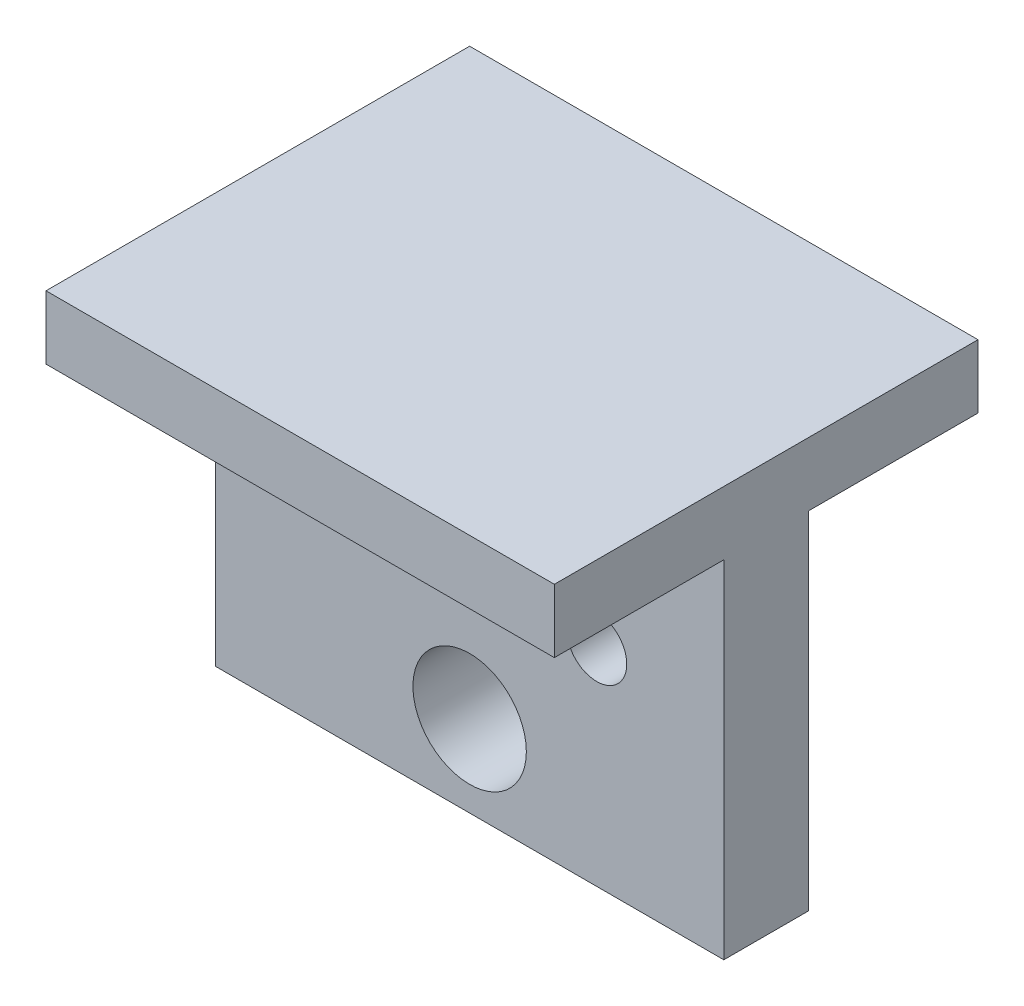
ISO-10303-21;
HEADER;
FILE_DESCRIPTION(('STEP AP214'),'2;1');
FILE_NAME('part.step','',(''),(''),'','','');
FILE_SCHEMA(('AUTOMOTIVE_DESIGN { 1 0 10303 214 1 1 1 1 }'));
ENDSEC;
DATA;
#1=APPLICATION_CONTEXT('core data for automotive mechanical design processes');
#2=APPLICATION_PROTOCOL_DEFINITION('international standard','automotive_design',2000,#1);
#3=PRODUCT_CONTEXT('',#1,'mechanical');
#4=PRODUCT('Part','Part','',(#3));
#5=PRODUCT_RELATED_PRODUCT_CATEGORY('part','',(#4));
#6=PRODUCT_DEFINITION_FORMATION('','',#4);
#7=PRODUCT_DEFINITION_CONTEXT('part definition',#1,'design');
#8=PRODUCT_DEFINITION('design','',#6,#7);
#9=PRODUCT_DEFINITION_SHAPE('','',#8);
#10=(LENGTH_UNIT() NAMED_UNIT(*) SI_UNIT(.MILLI.,.METRE.));
#11=(NAMED_UNIT(*) PLANE_ANGLE_UNIT() SI_UNIT($,.RADIAN.));
#12=(NAMED_UNIT(*) SI_UNIT($,.STERADIAN.) SOLID_ANGLE_UNIT());
#13=UNCERTAINTY_MEASURE_WITH_UNIT(LENGTH_MEASURE(1.E-05),#10,'distance_accuracy_value','');
#14=(GEOMETRIC_REPRESENTATION_CONTEXT(3) GLOBAL_UNCERTAINTY_ASSIGNED_CONTEXT((#13)) GLOBAL_UNIT_ASSIGNED_CONTEXT((#10,
#11,#12)) REPRESENTATION_CONTEXT('',''));
#15=CARTESIAN_POINT('',(0.,0.,0.));
#16=DIRECTION('',(0.,0.,1.));
#17=DIRECTION('',(1.,0.,0.));
#18=AXIS2_PLACEMENT_3D('',#15,#16,#17);
#19=CARTESIAN_POINT('',(0.,39.7023307712424,31.75));
#20=DIRECTION('',(0.,1.,0.));
#21=DIRECTION('',(0.,0.,1.));
#22=AXIS2_PLACEMENT_3D('',#19,#20,#21);
#23=PLANE('',#22);
#24=DIRECTION('',(1.,0.,0.));
#25=VECTOR('',#24,1.);
#26=CARTESIAN_POINT('',(0.,39.7023307712424,-6.35));
#27=LINE('',#26,#25);
#28=CARTESIAN_POINT('',(-38.1,39.7023307712424,-6.35));
#29=VERTEX_POINT('',#28);
#30=CARTESIAN_POINT('',(38.1,39.7023307712424,-6.35));
#31=VERTEX_POINT('',#30);
#32=EDGE_CURVE('E275',#29,#31,#27,.T.);
#33=ORIENTED_EDGE('',*,*,#32,.F.);
#34=DIRECTION('',(0.,0.,-1.));
#35=VECTOR('',#34,1.);
#36=CARTESIAN_POINT('',(-38.1,39.7023307712424,31.75));
#37=LINE('',#36,#35);
#38=CARTESIAN_POINT('',(-38.1,39.7023307712424,-31.75));
#39=VERTEX_POINT('',#38);
#40=EDGE_CURVE('E88',#29,#39,#37,.T.);
#41=ORIENTED_EDGE('',*,*,#40,.T.);
#42=DIRECTION('',(1.,0.,0.));
#43=VECTOR('',#42,1.);
#44=CARTESIAN_POINT('',(0.,39.7023307712424,-31.75));
#45=LINE('',#44,#43);
#46=CARTESIAN_POINT('',(38.1,39.7023307712424,-31.75));
#47=VERTEX_POINT('',#46);
#48=EDGE_CURVE('E156',#39,#47,#45,.T.);
#49=ORIENTED_EDGE('',*,*,#48,.T.);
#50=DIRECTION('',(0.,0.,-1.));
#51=VECTOR('',#50,1.);
#52=CARTESIAN_POINT('',(38.1,39.7023307712424,31.75));
#53=LINE('',#52,#51);
#54=EDGE_CURVE('E49',#31,#47,#53,.T.);
#55=ORIENTED_EDGE('',*,*,#54,.F.);
#56=EDGE_LOOP('',(#33,#41,#49,#55));
#57=FACE_BOUND('',#56,.T.);
#58=ADVANCED_FACE('F41',(#57),#23,.F.);
#59=CARTESIAN_POINT('',(-38.1,39.7023307712424,31.75));
#60=VERTEX_POINT('',#59);
#61=CARTESIAN_POINT('',(-38.1,39.7023307712424,6.35));
#62=VERTEX_POINT('',#61);
#63=EDGE_CURVE('E65',#60,#62,#37,.T.);
#64=ORIENTED_EDGE('',*,*,#63,.T.);
#65=DIRECTION('',(1.,0.,0.));
#66=VECTOR('',#65,1.);
#67=CARTESIAN_POINT('',(0.,39.7023307712424,6.35));
#68=LINE('',#67,#66);
#69=CARTESIAN_POINT('',(38.1,39.7023307712424,6.35));
#70=VERTEX_POINT('',#69);
#71=EDGE_CURVE('E124',#62,#70,#68,.T.);
#72=ORIENTED_EDGE('',*,*,#71,.T.);
#73=CARTESIAN_POINT('',(38.1,39.7023307712424,31.75));
#74=VERTEX_POINT('',#73);
#75=EDGE_CURVE('E11',#74,#70,#53,.T.);
#76=ORIENTED_EDGE('',*,*,#75,.F.);
#77=DIRECTION('',(1.,0.,0.));
#78=VECTOR('',#77,1.);
#79=CARTESIAN_POINT('',(0.,39.7023307712424,31.75));
#80=LINE('',#79,#78);
#81=EDGE_CURVE('E131',#60,#74,#80,.T.);
#82=ORIENTED_EDGE('',*,*,#81,.F.);
#83=EDGE_LOOP('',(#64,#72,#76,#82));
#84=FACE_BOUND('',#83,.T.);
#85=ADVANCED_FACE('F43',(#84),#23,.F.);
#86=CARTESIAN_POINT('',(38.1,0.,31.75));
#87=DIRECTION('',(-1.,0.,0.));
#88=DIRECTION('',(0.,0.,1.));
#89=AXIS2_PLACEMENT_3D('',#86,#87,#88);
#90=PLANE('',#89);
#91=DIRECTION('',(0.,1.,0.));
#92=VECTOR('',#91,1.);
#93=CARTESIAN_POINT('',(38.1,0.,-31.75));
#94=LINE('',#93,#92);
#95=CARTESIAN_POINT('',(38.1,49.2258758493717,-31.75));
#96=VERTEX_POINT('',#95);
#97=EDGE_CURVE('E148',#47,#96,#94,.T.);
#98=ORIENTED_EDGE('',*,*,#97,.T.);
#99=DIRECTION('',(0.,0.,-1.));
#100=VECTOR('',#99,1.);
#101=CARTESIAN_POINT('',(38.1,49.2258758493717,31.75));
#102=LINE('',#101,#100);
#103=CARTESIAN_POINT('',(38.1,49.2258758493717,31.75));
#104=VERTEX_POINT('',#103);
#105=EDGE_CURVE('E135',#104,#96,#102,.T.);
#106=ORIENTED_EDGE('',*,*,#105,.F.);
#107=DIRECTION('',(0.,1.,0.));
#108=VECTOR('',#107,1.);
#109=CARTESIAN_POINT('',(38.1,0.,31.75));
#110=LINE('',#109,#108);
#111=EDGE_CURVE('E95',#74,#104,#110,.T.);
#112=ORIENTED_EDGE('',*,*,#111,.F.);
#113=ORIENTED_EDGE('',*,*,#75,.T.);
#114=DIRECTION('',(0.,1.,0.));
#115=VECTOR('',#114,1.);
#116=CARTESIAN_POINT('',(38.1,0.,6.35));
#117=LINE('',#116,#115);
#118=CARTESIAN_POINT('',(38.1,-12.224,6.35));
#119=VERTEX_POINT('',#118);
#120=EDGE_CURVE('E56',#119,#70,#117,.T.);
#121=ORIENTED_EDGE('',*,*,#120,.F.);
#122=DIRECTION('',(0.,0.,-1.));
#123=VECTOR('',#122,1.);
#124=CARTESIAN_POINT('',(38.1,-12.224,6.35));
#125=LINE('',#124,#123);
#126=CARTESIAN_POINT('',(38.1,-12.224,-6.35));
#127=VERTEX_POINT('',#126);
#128=EDGE_CURVE('E160',#119,#127,#125,.T.);
#129=ORIENTED_EDGE('',*,*,#128,.T.);
#130=DIRECTION('',(0.,1.,0.));
#131=VECTOR('',#130,1.);
#132=CARTESIAN_POINT('',(38.1,0.,-6.35));
#133=LINE('',#132,#131);
#134=EDGE_CURVE('E151',#127,#31,#133,.T.);
#135=ORIENTED_EDGE('',*,*,#134,.T.);
#136=ORIENTED_EDGE('',*,*,#54,.T.);
#137=EDGE_LOOP('',(#98,#106,#112,#113,#121,#129,#135,#136));
#138=FACE_BOUND('',#137,.T.);
#139=ADVANCED_FACE('F147',(#138),#90,.F.);
#140=CARTESIAN_POINT('',(0.,49.2258758493717,31.75));
#141=DIRECTION('',(0.,1.,0.));
#142=DIRECTION('',(0.,0.,1.));
#143=AXIS2_PLACEMENT_3D('',#140,#141,#142);
#144=PLANE('',#143);
#145=DIRECTION('',(1.,0.,0.));
#146=VECTOR('',#145,1.);
#147=CARTESIAN_POINT('',(0.,49.2258758493717,-31.75));
#148=LINE('',#147,#146);
#149=CARTESIAN_POINT('',(-38.1,49.2258758493717,-31.75));
#150=VERTEX_POINT('',#149);
#151=EDGE_CURVE('E157',#150,#96,#148,.T.);
#152=ORIENTED_EDGE('',*,*,#151,.F.);
#153=DIRECTION('',(0.,0.,-1.));
#154=VECTOR('',#153,1.);
#155=CARTESIAN_POINT('',(-38.1,49.2258758493717,31.75));
#156=LINE('',#155,#154);
#157=CARTESIAN_POINT('',(-38.1,49.2258758493717,31.75));
#158=VERTEX_POINT('',#157);
#159=EDGE_CURVE('E133',#158,#150,#156,.T.);
#160=ORIENTED_EDGE('',*,*,#159,.F.);
#161=DIRECTION('',(1.,0.,0.));
#162=VECTOR('',#161,1.);
#163=CARTESIAN_POINT('',(0.,49.2258758493717,31.75));
#164=LINE('',#163,#162);
#165=EDGE_CURVE('E166',#158,#104,#164,.T.);
#166=ORIENTED_EDGE('',*,*,#165,.T.);
#167=ORIENTED_EDGE('',*,*,#105,.T.);
#168=EDGE_LOOP('',(#152,#160,#166,#167));
#169=FACE_BOUND('',#168,.T.);
#170=ADVANCED_FACE('F179',(#169),#144,.T.);
#171=CARTESIAN_POINT('',(-38.1,0.,31.75));
#172=DIRECTION('',(-1.,0.,0.));
#173=DIRECTION('',(0.,0.,1.));
#174=AXIS2_PLACEMENT_3D('',#171,#172,#173);
#175=PLANE('',#174);
#176=DIRECTION('',(0.,1.,0.));
#177=VECTOR('',#176,1.);
#178=CARTESIAN_POINT('',(-38.1,0.,-31.75));
#179=LINE('',#178,#177);
#180=EDGE_CURVE('E139',#39,#150,#179,.T.);
#181=ORIENTED_EDGE('',*,*,#180,.F.);
#182=ORIENTED_EDGE('',*,*,#40,.F.);
#183=DIRECTION('',(0.,-1.,0.));
#184=VECTOR('',#183,1.);
#185=CARTESIAN_POINT('',(-38.1,0.,-6.35));
#186=LINE('',#185,#184);
#187=CARTESIAN_POINT('',(-38.1,-12.224,-6.35));
#188=VERTEX_POINT('',#187);
#189=EDGE_CURVE('E276',#29,#188,#186,.T.);
#190=ORIENTED_EDGE('',*,*,#189,.T.);
#191=DIRECTION('',(0.,0.,-1.));
#192=VECTOR('',#191,1.);
#193=CARTESIAN_POINT('',(-38.1,-12.224,6.35));
#194=LINE('',#193,#192);
#195=CARTESIAN_POINT('',(-38.1,-12.224,6.35));
#196=VERTEX_POINT('',#195);
#197=EDGE_CURVE('E122',#196,#188,#194,.T.);
#198=ORIENTED_EDGE('',*,*,#197,.F.);
#199=DIRECTION('',(0.,-1.,0.));
#200=VECTOR('',#199,1.);
#201=CARTESIAN_POINT('',(-38.1,0.,6.35));
#202=LINE('',#201,#200);
#203=EDGE_CURVE('E117',#62,#196,#202,.T.);
#204=ORIENTED_EDGE('',*,*,#203,.F.);
#205=ORIENTED_EDGE('',*,*,#63,.F.);
#206=DIRECTION('',(0.,1.,0.));
#207=VECTOR('',#206,1.);
#208=CARTESIAN_POINT('',(-38.1,0.,31.75));
#209=LINE('',#208,#207);
#210=EDGE_CURVE('E137',#60,#158,#209,.T.);
#211=ORIENTED_EDGE('',*,*,#210,.T.);
#212=ORIENTED_EDGE('',*,*,#159,.T.);
#213=EDGE_LOOP('',(#181,#182,#190,#198,#204,#205,#211,#212));
#214=FACE_BOUND('',#213,.T.);
#215=ADVANCED_FACE('F119',(#214),#175,.T.);
#216=CARTESIAN_POINT('',(0.,0.,31.75));
#217=DIRECTION('',(0.,0.,1.));
#218=DIRECTION('',(1.,0.,0.));
#219=AXIS2_PLACEMENT_3D('',#216,#217,#218);
#220=PLANE('',#219);
#221=ORIENTED_EDGE('',*,*,#81,.T.);
#222=ORIENTED_EDGE('',*,*,#111,.T.);
#223=ORIENTED_EDGE('',*,*,#165,.F.);
#224=ORIENTED_EDGE('',*,*,#210,.F.);
#225=EDGE_LOOP('',(#221,#222,#223,#224));
#226=FACE_BOUND('',#225,.T.);
#227=ADVANCED_FACE('F170',(#226),#220,.T.);
#228=CARTESIAN_POINT('',(0.,0.,-31.75));
#229=DIRECTION('',(0.,0.,1.));
#230=DIRECTION('',(1.,0.,0.));
#231=AXIS2_PLACEMENT_3D('',#228,#229,#230);
#232=PLANE('',#231);
#233=ORIENTED_EDGE('',*,*,#48,.F.);
#234=ORIENTED_EDGE('',*,*,#180,.T.);
#235=ORIENTED_EDGE('',*,*,#151,.T.);
#236=ORIENTED_EDGE('',*,*,#97,.F.);
#237=EDGE_LOOP('',(#233,#234,#235,#236));
#238=FACE_BOUND('',#237,.T.);
#239=ADVANCED_FACE('F154',(#238),#232,.F.);
#240=CARTESIAN_POINT('',(0.,-12.224,6.35));
#241=DIRECTION('',(0.,1.,0.));
#242=DIRECTION('',(0.,0.,1.));
#243=AXIS2_PLACEMENT_3D('',#240,#241,#242);
#244=PLANE('',#243);
#245=DIRECTION('',(1.,0.,0.));
#246=VECTOR('',#245,1.);
#247=CARTESIAN_POINT('',(0.,-12.224,-6.35));
#248=LINE('',#247,#246);
#249=EDGE_CURVE('E278',#188,#127,#248,.T.);
#250=ORIENTED_EDGE('',*,*,#249,.T.);
#251=ORIENTED_EDGE('',*,*,#128,.F.);
#252=DIRECTION('',(1.,0.,0.));
#253=VECTOR('',#252,1.);
#254=CARTESIAN_POINT('',(0.,-12.224,6.35));
#255=LINE('',#254,#253);
#256=EDGE_CURVE('E123',#196,#119,#255,.T.);
#257=ORIENTED_EDGE('',*,*,#256,.F.);
#258=ORIENTED_EDGE('',*,*,#197,.T.);
#259=EDGE_LOOP('',(#250,#251,#257,#258));
#260=FACE_BOUND('',#259,.T.);
#261=ADVANCED_FACE('F177',(#260),#244,.F.);
#262=CARTESIAN_POINT('',(0.,0.,6.35));
#263=DIRECTION('',(0.,0.,-1.));
#264=DIRECTION('',(-1.,0.,0.));
#265=AXIS2_PLACEMENT_3D('',#262,#263,#264);
#266=CYLINDRICAL_SURFACE('',#265,8.5);
#267=CARTESIAN_POINT('',(0.,0.,6.35));
#268=DIRECTION('',(0.,0.,1.));
#269=DIRECTION('',(1.,0.,0.));
#270=AXIS2_PLACEMENT_3D('',#267,#268,#269);
#271=CIRCLE('',#270,8.5);
#272=CARTESIAN_POINT('',(8.5,0.,6.35));
#273=VERTEX_POINT('',#272);
#274=EDGE_CURVE('E129',#273,#273,#271,.T.);
#275=ORIENTED_EDGE('',*,*,#274,.T.);
#276=EDGE_LOOP('',(#275));
#277=FACE_BOUND('',#276,.T.);
#278=CARTESIAN_POINT('',(0.,0.,-6.35));
#279=DIRECTION('',(0.,0.,1.));
#280=DIRECTION('',(1.,0.,0.));
#281=AXIS2_PLACEMENT_3D('',#278,#279,#280);
#282=CIRCLE('',#281,8.5);
#283=CARTESIAN_POINT('',(8.5,0.,-6.35));
#284=VERTEX_POINT('',#283);
#285=EDGE_CURVE('E274',#284,#284,#282,.T.);
#286=ORIENTED_EDGE('',*,*,#285,.F.);
#287=EDGE_LOOP('',(#286));
#288=FACE_BOUND('',#287,.T.);
#289=ADVANCED_FACE('F211',(#277,#288),#266,.F.);
#290=CARTESIAN_POINT('',(19.05,18.8743307712424,6.35));
#291=DIRECTION('',(0.,0.,-1.));
#292=DIRECTION('',(-1.,0.,0.));
#293=AXIS2_PLACEMENT_3D('',#290,#291,#292);
#294=CYLINDRICAL_SURFACE('',#293,4.5);
#295=CARTESIAN_POINT('',(19.05,18.8743307712424,6.35));
#296=DIRECTION('',(0.,0.,1.));
#297=DIRECTION('',(1.,0.,0.));
#298=AXIS2_PLACEMENT_3D('',#295,#296,#297);
#299=CIRCLE('',#298,4.5);
#300=CARTESIAN_POINT('',(23.55,18.8743307712424,6.35));
#301=VERTEX_POINT('',#300);
#302=EDGE_CURVE('E293',#301,#301,#299,.T.);
#303=ORIENTED_EDGE('',*,*,#302,.T.);
#304=EDGE_LOOP('',(#303));
#305=FACE_BOUND('',#304,.T.);
#306=CARTESIAN_POINT('',(19.05,18.8743307712424,-6.35));
#307=DIRECTION('',(0.,0.,1.));
#308=DIRECTION('',(1.,0.,0.));
#309=AXIS2_PLACEMENT_3D('',#306,#307,#308);
#310=CIRCLE('',#309,4.5);
#311=CARTESIAN_POINT('',(23.55,18.8743307712424,-6.35));
#312=VERTEX_POINT('',#311);
#313=EDGE_CURVE('E270',#312,#312,#310,.T.);
#314=ORIENTED_EDGE('',*,*,#313,.F.);
#315=EDGE_LOOP('',(#314));
#316=FACE_BOUND('',#315,.T.);
#317=ADVANCED_FACE('F221',(#305,#316),#294,.F.);
#318=CARTESIAN_POINT('',(-19.05,18.8743307712424,6.35));
#319=DIRECTION('',(0.,0.,-1.));
#320=DIRECTION('',(-1.,0.,0.));
#321=AXIS2_PLACEMENT_3D('',#318,#319,#320);
#322=CYLINDRICAL_SURFACE('',#321,4.5);
#323=CARTESIAN_POINT('',(-19.05,18.8743307712424,6.35));
#324=DIRECTION('',(0.,0.,1.));
#325=DIRECTION('',(1.,0.,0.));
#326=AXIS2_PLACEMENT_3D('',#323,#324,#325);
#327=CIRCLE('',#326,4.5);
#328=CARTESIAN_POINT('',(-14.55,18.8743307712424,6.35));
#329=VERTEX_POINT('',#328);
#330=EDGE_CURVE('E285',#329,#329,#327,.T.);
#331=ORIENTED_EDGE('',*,*,#330,.T.);
#332=EDGE_LOOP('',(#331));
#333=FACE_BOUND('',#332,.T.);
#334=CARTESIAN_POINT('',(-19.05,18.8743307712424,-6.35));
#335=DIRECTION('',(0.,0.,1.));
#336=DIRECTION('',(1.,0.,0.));
#337=AXIS2_PLACEMENT_3D('',#334,#335,#336);
#338=CIRCLE('',#337,4.5);
#339=CARTESIAN_POINT('',(-14.55,18.8743307712424,-6.35));
#340=VERTEX_POINT('',#339);
#341=EDGE_CURVE('E266',#340,#340,#338,.T.);
#342=ORIENTED_EDGE('',*,*,#341,.F.);
#343=EDGE_LOOP('',(#342));
#344=FACE_BOUND('',#343,.T.);
#345=ADVANCED_FACE('F231',(#333,#344),#322,.F.);
#346=CARTESIAN_POINT('',(0.,0.,6.35));
#347=DIRECTION('',(0.,0.,1.));
#348=DIRECTION('',(1.,0.,0.));
#349=AXIS2_PLACEMENT_3D('',#346,#347,#348);
#350=PLANE('',#349);
#351=ORIENTED_EDGE('',*,*,#330,.F.);
#352=EDGE_LOOP('',(#351));
#353=FACE_BOUND('',#352,.T.);
#354=ORIENTED_EDGE('',*,*,#302,.F.);
#355=EDGE_LOOP('',(#354));
#356=FACE_BOUND('',#355,.T.);
#357=ORIENTED_EDGE('',*,*,#274,.F.);
#358=EDGE_LOOP('',(#357));
#359=FACE_BOUND('',#358,.T.);
#360=ORIENTED_EDGE('',*,*,#71,.F.);
#361=ORIENTED_EDGE('',*,*,#203,.T.);
#362=ORIENTED_EDGE('',*,*,#256,.T.);
#363=ORIENTED_EDGE('',*,*,#120,.T.);
#364=EDGE_LOOP('',(#360,#361,#362,#363));
#365=FACE_BOUND('',#364,.T.);
#366=ADVANCED_FACE('F126',(#353,#356,#359,#365),#350,.T.);
#367=CARTESIAN_POINT('',(0.,0.,-6.35));
#368=DIRECTION('',(0.,0.,1.));
#369=DIRECTION('',(1.,0.,0.));
#370=AXIS2_PLACEMENT_3D('',#367,#368,#369);
#371=PLANE('',#370);
#372=ORIENTED_EDGE('',*,*,#341,.T.);
#373=EDGE_LOOP('',(#372));
#374=FACE_BOUND('',#373,.T.);
#375=ORIENTED_EDGE('',*,*,#313,.T.);
#376=EDGE_LOOP('',(#375));
#377=FACE_BOUND('',#376,.T.);
#378=ORIENTED_EDGE('',*,*,#285,.T.);
#379=EDGE_LOOP('',(#378));
#380=FACE_BOUND('',#379,.T.);
#381=ORIENTED_EDGE('',*,*,#32,.T.);
#382=ORIENTED_EDGE('',*,*,#134,.F.);
#383=ORIENTED_EDGE('',*,*,#249,.F.);
#384=ORIENTED_EDGE('',*,*,#189,.F.);
#385=EDGE_LOOP('',(#381,#382,#383,#384));
#386=FACE_BOUND('',#385,.T.);
#387=ADVANCED_FACE('F249',(#374,#377,#380,#386),#371,.F.);
#388=CLOSED_SHELL('',(#58,#85,#139,#170,#215,#227,#239,#261,#289,#317,#345,#366,#387));
#389=MANIFOLD_SOLID_BREP('B2',#388);
#390=ADVANCED_BREP_SHAPE_REPRESENTATION('',(#18,#389),#14);
#391=SHAPE_DEFINITION_REPRESENTATION(#9,#390);
ENDSEC;
END-ISO-10303-21;
